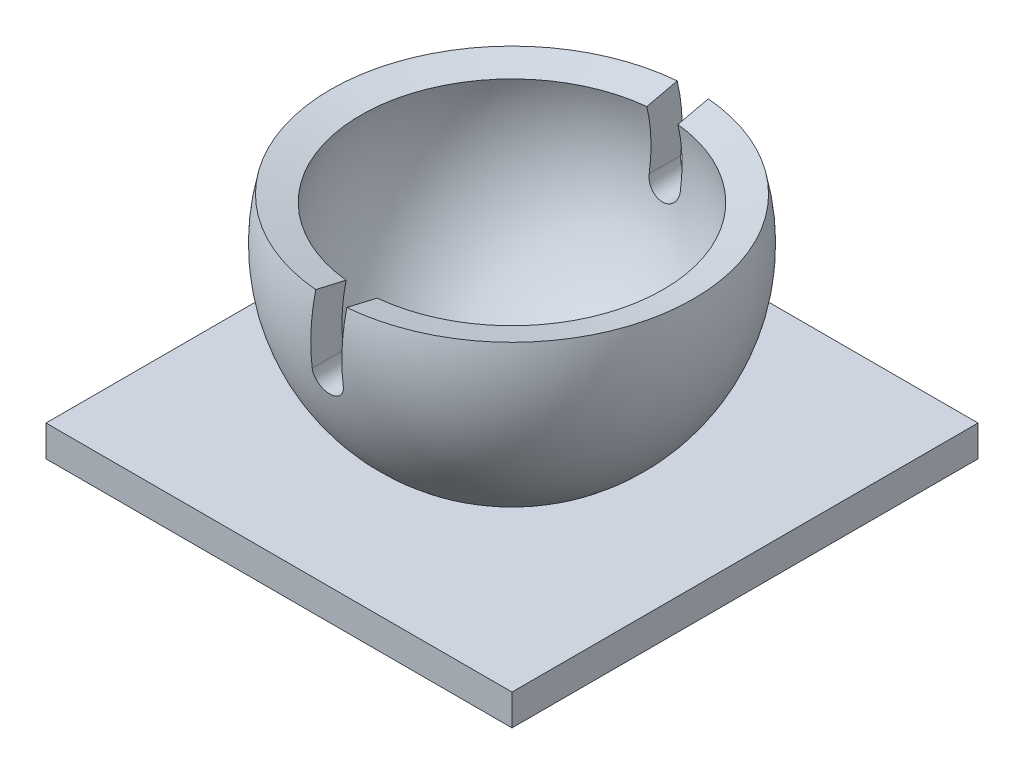
ISO-10303-21;
HEADER;
FILE_DESCRIPTION(('STEP AP214'),'2;1');
FILE_NAME('part.step','',(''),(''),'','','');
FILE_SCHEMA(('AUTOMOTIVE_DESIGN { 1 0 10303 214 1 1 1 1 }'));
ENDSEC;
DATA;
#1=APPLICATION_CONTEXT('core data for automotive mechanical design processes');
#2=APPLICATION_PROTOCOL_DEFINITION('international standard','automotive_design',2000,#1);
#3=PRODUCT_CONTEXT('',#1,'mechanical');
#4=PRODUCT('Part','Part','',(#3));
#5=PRODUCT_RELATED_PRODUCT_CATEGORY('part','',(#4));
#6=PRODUCT_DEFINITION_FORMATION('','',#4);
#7=PRODUCT_DEFINITION_CONTEXT('part definition',#1,'design');
#8=PRODUCT_DEFINITION('design','',#6,#7);
#9=PRODUCT_DEFINITION_SHAPE('','',#8);
#10=(LENGTH_UNIT() NAMED_UNIT(*) SI_UNIT(.MILLI.,.METRE.));
#11=(NAMED_UNIT(*) PLANE_ANGLE_UNIT() SI_UNIT($,.RADIAN.));
#12=(NAMED_UNIT(*) SI_UNIT($,.STERADIAN.) SOLID_ANGLE_UNIT());
#13=UNCERTAINTY_MEASURE_WITH_UNIT(LENGTH_MEASURE(1.E-05),#10,'distance_accuracy_value','');
#14=(GEOMETRIC_REPRESENTATION_CONTEXT(3) GLOBAL_UNCERTAINTY_ASSIGNED_CONTEXT((#13)) GLOBAL_UNIT_ASSIGNED_CONTEXT((#10,
#11,#12)) REPRESENTATION_CONTEXT('',''));
#15=CARTESIAN_POINT('',(0.,0.,0.));
#16=DIRECTION('',(0.,0.,1.));
#17=DIRECTION('',(1.,0.,0.));
#18=AXIS2_PLACEMENT_3D('',#15,#16,#17);
#19=CARTESIAN_POINT('',(0.,2.16217489974353,0.));
#20=DIRECTION('',(0.,1.,0.));
#21=DIRECTION('',(-1.,0.,0.));
#22=AXIS2_PLACEMENT_3D('',#19,#20,#21);
#23=CONICAL_SURFACE('',#22,23.3581886187045,1.34218204127667);
#24=CARTESIAN_POINT('',(0.,2.16217489974353,0.));
#25=DIRECTION('',(0.,1.,0.));
#26=DIRECTION('',(-1.,0.,0.));
#27=AXIS2_PLACEMENT_3D('',#24,#25,#26);
#28=CIRCLE('',#27,23.3581886187045);
#29=CARTESIAN_POINT('',(2.,2.16217489974353,23.2724080306911));
#30=VERTEX_POINT('',#29);
#31=CARTESIAN_POINT('',(2.,2.16217489974353,-23.2724080306911));
#32=VERTEX_POINT('',#31);
#33=EDGE_CURVE('E236',#30,#32,#28,.T.);
#34=ORIENTED_EDGE('',*,*,#33,.T.);
#35=CARTESIAN_POINT('',(2.,8.69454104475557,-51.3934916791892));
#36=CARTESIAN_POINT('',(2.,8.44441020781194,-50.3176874556999));
#37=CARTESIAN_POINT('',(2.,8.19429013732023,-49.2418807287818));
#38=CARTESIAN_POINT('',(2.,7.69407505448133,-47.0902504291092));
#39=CARTESIAN_POINT('',(2.,7.44398004240129,-46.0144268562924));
#40=CARTESIAN_POINT('',(2.,6.94321866661159,-43.8601701219227));
#41=CARTESIAN_POINT('',(2.,6.6925523838851,-42.7817369415447));
#42=CARTESIAN_POINT('',(2.,6.19126436017399,-40.6248712911531));
#43=CARTESIAN_POINT('',(2.,5.94064261877963,-39.5464388212347));
#44=CARTESIAN_POINT('',(2.,5.43004718041413,-37.3490849054346));
#45=CARTESIAN_POINT('',(2.,5.17007552951409,-36.2301629841016));
#46=CARTESIAN_POINT('',(2.,4.65020009983294,-33.9922684978802));
#47=CARTESIAN_POINT('',(2.,4.39029632328636,-32.8732959324727));
#48=CARTESIAN_POINT('',(2.,3.87122244819157,-30.6380477327353));
#49=CARTESIAN_POINT('',(2.,3.61205210220396,-29.5217721558681));
#50=CARTESIAN_POINT('',(2.,3.09388052803709,-27.289309718681));
#51=CARTESIAN_POINT('',(2.,2.83487928452789,-26.1731228619196));
#52=CARTESIAN_POINT('',(2.,2.33039867048759,-23.9981171179131));
#53=CARTESIAN_POINT('',(2.,2.08490904261678,-22.9393006098968));
#54=CARTESIAN_POINT('',(2.,1.59410599634934,-20.8211830507793));
#55=CARTESIAN_POINT('',(2.,1.34879268685224,-19.7618819744367));
#56=CARTESIAN_POINT('',(2.,0.856664181966741,-17.6347973194442));
#57=CARTESIAN_POINT('',(2.,0.609852459648279,-16.5670129372667));
#58=CARTESIAN_POINT('',(2.,0.117343228377695,-14.4328450415481));
#59=CARTESIAN_POINT('',(2.,-0.128355386803524,-13.3664617836209));
#60=CARTESIAN_POINT('',(2.,-0.492399487907965,-11.7813281502943));
#61=CARTESIAN_POINT('',(2.,-0.61131905529437,-11.2627096573455));
#62=CARTESIAN_POINT('',(2.,-0.848643448048677,-10.2252500076351));
#63=CARTESIAN_POINT('',(2.,-0.967048170218366,-9.70640882724113));
#64=CARTESIAN_POINT('',(2.,-1.2036892513655,-8.66557452548756));
#65=CARTESIAN_POINT('',(2.,-1.32192079592858,-8.14358030937122));
#66=CARTESIAN_POINT('',(2.,-1.55688593228373,-7.09964499267051));
#67=CARTESIAN_POINT('',(2.,-1.67362053332015,-6.57770412026182));
#68=CARTESIAN_POINT('',(2.,-1.84559396369289,-5.79929507989012));
#69=CARTESIAN_POINT('',(2.,-1.90186271874453,-5.54305472071532));
#70=CARTESIAN_POINT('',(2.,-2.01344383844931,-5.03036039633225));
#71=CARTESIAN_POINT('',(2.,-2.06875618592246,-4.77390642737345));
#72=CARTESIAN_POINT('',(2.,-2.1780975481452,-4.25999316997177));
#73=CARTESIAN_POINT('',(2.,-2.23212265011098,-4.002533047598));
#74=CARTESIAN_POINT('',(2.,-2.33791234494727,-3.48715937532827));
#75=CARTESIAN_POINT('',(2.,-2.3896770732201,-3.22924585355757));
#76=CARTESIAN_POINT('',(2.,-2.46412408433893,-2.84350097700784));
#77=CARTESIAN_POINT('',(2.,-2.48825650411705,-2.71595030275213));
#78=CARTESIAN_POINT('',(2.,-2.53527009134437,-2.460619288343));
#79=CARTESIAN_POINT('',(2.,-2.55815127741826,-2.33283895163739));
#80=CARTESIAN_POINT('',(2.,-2.60225571235431,-2.07693043619601));
#81=CARTESIAN_POINT('',(2.,-2.62347820180937,-1.94880212560327));
#82=CARTESIAN_POINT('',(2.,-2.66367177095657,-1.69218672798008));
#83=CARTESIAN_POINT('',(2.,-2.68264281441033,-1.56369963520888));
#84=CARTESIAN_POINT('',(2.,-2.71745485776008,-1.3070562477473));
#85=CARTESIAN_POINT('',(2.,-2.73331341815711,-1.17890237447306));
#86=CARTESIAN_POINT('',(2.,-2.76109075308505,-0.922161551035726));
#87=CARTESIAN_POINT('',(2.,-2.77300963408229,-0.793574612670724));
#88=CARTESIAN_POINT('',(2.,-2.7918966544362,-0.536180137725813));
#89=CARTESIAN_POINT('',(2.,-2.79887068675255,-0.40737304772608));
#90=CARTESIAN_POINT('',(2.,-2.80713929932209,-0.149578284883391));
#91=CARTESIAN_POINT('',(2.,-2.80843426856049,-0.0205906250138978));
#92=CARTESIAN_POINT('',(2.,-2.80519656917286,0.236744291342711));
#93=CARTESIAN_POINT('',(2.,-2.80068935797277,0.365091881839768));
#94=CARTESIAN_POINT('',(2.,-2.78640712898619,0.621494588177228));
#95=CARTESIAN_POINT('',(2.,-2.77663164075129,0.749549676871993));
#96=CARTESIAN_POINT('',(2.,-2.75271843548304,1.00540392634853));
#97=CARTESIAN_POINT('',(2.,-2.73857521853914,1.13320255882091));
#98=CARTESIAN_POINT('',(2.,-2.70691376566308,1.38837236574765));
#99=CARTESIAN_POINT('',(2.,-2.6893955407824,1.51574354160034));
#100=CARTESIAN_POINT('',(2.,-2.65171376377919,1.77087921878172));
#101=CARTESIAN_POINT('',(2.,-2.63153479811795,1.89864141373638));
#102=CARTESIAN_POINT('',(2.,-2.58926963288461,2.15384584538441));
#103=CARTESIAN_POINT('',(2.,-2.56718344956086,2.28128808479408));
#104=CARTESIAN_POINT('',(2.,-2.49885013836222,2.66309548926931));
#105=CARTESIAN_POINT('',(2.,-2.45050604895816,2.91708331577157));
#106=CARTESIAN_POINT('',(2.,-2.34997166195666,3.42783272971789));
#107=CARTESIAN_POINT('',(2.,-2.29773839085315,3.68458569701823));
#108=CARTESIAN_POINT('',(2.,-2.19126767621757,4.19770376099338));
#109=CARTESIAN_POINT('',(2.,-2.13703001561726,4.45406881251037));
#110=CARTESIAN_POINT('',(2.,-2.02742117230043,4.96583018586036));
#111=CARTESIAN_POINT('',(2.,-1.97205345147424,5.22122725261318));
#112=CARTESIAN_POINT('',(2.,-1.8604530825348,5.73182376738308));
#113=CARTESIAN_POINT('',(2.,-1.80422046129231,5.98702322128192));
#114=CARTESIAN_POINT('',(2.,-1.63245232713266,6.7622394207894));
#115=CARTESIAN_POINT('',(2.,-1.51597525436658,7.28204725850749));
#116=CARTESIAN_POINT('',(2.,-1.2816227161113,8.32173723628004));
#117=CARTESIAN_POINT('',(2.,-1.16374630982008,8.84161916345176));
#118=CARTESIAN_POINT('',(2.,-0.92784532366664,9.87833186653486));
#119=CARTESIAN_POINT('',(2.,-0.809825152345477,10.3951636458648));
#120=CARTESIAN_POINT('',(2.,-0.573298998322862,11.4286110997478));
#121=CARTESIAN_POINT('',(2.,-0.454793113627369,11.9452267967529));
#122=CARTESIAN_POINT('',(2.,-0.214103630790685,12.9928766750854));
#123=CARTESIAN_POINT('',(2.,-0.0919101609219939,13.5239085879583));
#124=CARTESIAN_POINT('',(2.,0.152741897875409,14.5859405061611));
#125=CARTESIAN_POINT('',(2.,0.27520050030819,15.1169405083792));
#126=CARTESIAN_POINT('',(2.,0.643200561734419,16.7113733177108));
#127=CARTESIAN_POINT('',(2.,0.889021779313902,17.7747415476448));
#128=CARTESIAN_POINT('',(2.,1.37919893817848,19.8932060879681));
#129=CARTESIAN_POINT('',(2.,1.62355161836561,20.948303153318));
#130=CARTESIAN_POINT('',(2.,2.11243132626854,23.0580269311111));
#131=CARTESIAN_POINT('',(2.,2.35695825000927,24.1126536676496));
#132=CARTESIAN_POINT('',(2.,2.8593433945831,26.2785640006001));
#133=CARTESIAN_POINT('',(2.,3.11721155256767,27.3898452917712));
#134=CARTESIAN_POINT('',(2.,3.63311358480922,29.6124933600824));
#135=CARTESIAN_POINT('',(2.,3.8911474737169,30.7238601338215));
#136=CARTESIAN_POINT('',(2.,4.40793130524001,32.9492245039805));
#137=CARTESIAN_POINT('',(2.,4.66668148631043,34.0632220450227));
#138=CARTESIAN_POINT('',(2.,5.18424889318249,36.2911677694388));
#139=CARTESIAN_POINT('',(2.,5.44306611684087,37.4051159533106));
#140=CARTESIAN_POINT('',(2.,5.95151177593954,39.5932104510489));
#141=CARTESIAN_POINT('',(2.,6.20113821640629,40.6673572284954));
#142=CARTESIAN_POINT('',(2.,6.70043511786709,42.8156512753266));
#143=CARTESIAN_POINT('',(2.,6.9501055792557,43.8897985446196));
#144=CARTESIAN_POINT('',(2.,7.44888937828235,46.0355454257602));
#145=CARTESIAN_POINT('',(2.,7.69800263730427,47.1071450558826));
#146=CARTESIAN_POINT('',(2.,8.19625405044116,49.2503278453128));
#147=CARTESIAN_POINT('',(2.,8.44539220429837,50.3219110046805));
#148=CARTESIAN_POINT('',(2.,8.69454104475557,51.3934916791892));
#149=B_SPLINE_CURVE_WITH_KNOTS('',3,(#35,#36,#37,#38,#39,#40,#41,#42,#43,#44,#45,#46,#47,#48,
#49,#50,#51,#52,#53,#54,#55,#56,#57,#58,#59,#60,#61,#62,#63,#64,#65,#66,#67,#68,#69,#70,#71,#72,
#73,#74,#75,#76,#77,#78,#79,#80,#81,#82,#83,#84,#85,#86,#87,#88,#89,#90,#91,#92,#93,#94,#95,#96,
#97,#98,#99,#100,#101,#102,#103,#104,#105,#106,#107,#108,#109,#110,#111,#112,#113,#114,#115,
#116,#117,#118,#119,#120,#121,#122,#123,#124,#125,#126,#127,#128,#129,#130,#131,#132,#133,#134,
#135,#136,#137,#138,#139,#140,#141,#142,#143,#144,#145,#146,#147,#148),.UNSPECIFIED.,.F.,.F.,(4,
2,2,2,2,2,2,2,2,2,2,2,2,2,2,2,2,2,2,2,2,2,2,2,2,2,2,2,2,2,2,2,2,2,2,2,2,2,2,2,2,2,2,2,2,2,2,2,2,
2,2,2,2,2,2,2,4),(0.,3.31349988185216,6.62703196582337,9.94857759761049,13.270090903016,
16.7162690346055,20.1625490801313,23.6004501616125,27.0379772654849,30.2986854524587,
33.5606903623537,36.8485034885407,40.1314693532274,41.7277032220403,43.3242435218826,
44.9298922742201,46.5343946174647,47.3214307840259,48.1084810734909,48.8976785446559,
49.6868286757812,50.0762647435,50.4656950128634,50.8553025446078,51.244916346469,
51.6322644384265,52.0196020617895,52.4064773011235,52.7933260411744,53.1784832294001,
53.5636748172246,53.9493534356628,54.3350307912159,54.7230495031414,55.1110649097046,
55.8866647373648,56.6726925968421,57.4588058312319,58.2427932603044,59.0267563814228,
60.6248462394702,62.2240793768293,63.8144859811453,65.4045860912742,67.0393138711699,
68.6741269696807,71.948362657026,75.1974305558531,78.4452419048429,81.8676648444666,
85.2904500113806,88.7214089992471,92.1522692691114,95.4605833302057,98.7689287254693,
102.069451206136,105.36994246977),.UNSPECIFIED.);
#150=CARTESIAN_POINT('',(2.,1.25565710505479,-19.3592037886823));
#151=VERTEX_POINT('',#150);
#152=EDGE_CURVE('E245',#32,#151,#149,.T.);
#153=ORIENTED_EDGE('',*,*,#152,.T.);
#154=CARTESIAN_POINT('',(0.,1.25565710505479,0.));
#155=DIRECTION('',(0.,1.,0.));
#156=DIRECTION('',(-1.,0.,0.));
#157=AXIS2_PLACEMENT_3D('',#154,#155,#156);
#158=CIRCLE('',#157,19.4622396278468);
#159=CARTESIAN_POINT('',(2.,1.25565710505479,19.3592037886823));
#160=VERTEX_POINT('',#159);
#161=EDGE_CURVE('E229',#160,#151,#158,.T.);
#162=ORIENTED_EDGE('',*,*,#161,.F.);
#163=EDGE_CURVE('E244',#160,#30,#149,.T.);
#164=ORIENTED_EDGE('',*,*,#163,.T.);
#165=EDGE_LOOP('',(#34,#153,#162,#164));
#166=FACE_BOUND('',#165,.T.);
#167=ADVANCED_FACE('F35',(#166),#23,.F.);
#168=CARTESIAN_POINT('',(0.,-3.35099337748345,0.));
#169=DIRECTION('',(0.,1.,0.));
#170=DIRECTION('',(1.,0.,0.));
#171=AXIS2_PLACEMENT_3D('',#168,#169,#170);
#172=SPHERICAL_SURFACE('',#171,20.);
#173=CARTESIAN_POINT('',(0.,-23.3509933774835,0.));
#174=VERTEX_POINT('',#173);
#175=VERTEX_LOOP('',#174);
#176=FACE_BOUND('',#175,.T.);
#177=ORIENTED_EDGE('',*,*,#161,.T.);
#178=CARTESIAN_POINT('',(2.,-3.35099337748345,0.));
#179=DIRECTION('',(1.,0.,0.));
#180=DIRECTION('',(0.,0.,-1.));
#181=AXIS2_PLACEMENT_3D('',#178,#179,#180);
#182=CIRCLE('',#181,19.8997487421324);
#183=CARTESIAN_POINT('',(2.,-6.3804306290063,-19.667803892125));
#184=VERTEX_POINT('',#183);
#185=EDGE_CURVE('E241',#151,#184,#182,.F.);
#186=ORIENTED_EDGE('',*,*,#185,.T.);
#187=CARTESIAN_POINT('',(1.99999999,-6.3802306290063,-19.6678346981559));
#188=CARTESIAN_POINT('',(2.00000492924338,-6.43699906380611,-19.6590906866457));
#189=CARTESIAN_POINT('',(1.99759286722976,-6.49373977434951,-19.6503450418694));
#190=CARTESIAN_POINT('',(1.98795687162081,-6.60681734610184,-19.6329044490153));
#191=CARTESIAN_POINT('',(1.98073306294222,-6.66315421775637,-19.6242094996274));
#192=CARTESIAN_POINT('',(1.95190136374699,-6.83089931555426,-19.5983028234515));
#193=CARTESIAN_POINT('',(1.92313308554919,-6.94118743135091,-19.581246870168));
#194=CARTESIAN_POINT('',(1.84724845113372,-7.15542196601706,-19.5480743489547));
#195=CARTESIAN_POINT('',(1.80012163594724,-7.25936473078687,-19.5319583225348));
#196=CARTESIAN_POINT('',(1.68879655848839,-7.4578834619899,-19.501143449193));
#197=CARTESIAN_POINT('',(1.62460317515794,-7.55246209482621,-19.4864441988808));
#198=CARTESIAN_POINT('',(1.48127554317915,-7.72901768013369,-19.458976805754));
#199=CARTESIAN_POINT('',(1.40222058602788,-7.81105750210565,-19.446199034234));
#200=CARTESIAN_POINT('',(1.23113885814396,-7.96068702122408,-19.4228749457925));
#201=CARTESIAN_POINT('',(1.13911072052416,-8.02827519381715,-19.4123288643007));
#202=CARTESIAN_POINT('',(0.945821163044194,-8.1462440266236,-19.3939101879149));
#203=CARTESIAN_POINT('',(0.844676359441907,-8.19681123429498,-19.3860086154301));
#204=CARTESIAN_POINT('',(0.635171138290144,-8.28023777249555,-19.3729672403095));
#205=CARTESIAN_POINT('',(0.526811662409921,-8.31309940891011,-19.3678270780416));
#206=CARTESIAN_POINT('',(0.307193282780582,-8.35985044503843,-19.3605130885571));
#207=CARTESIAN_POINT('',(0.195977769331188,-8.37393894650324,-19.358308131762));
#208=CARTESIAN_POINT('',(-0.0272648929103377,-8.38336272334667,-19.3568333241558));
#209=CARTESIAN_POINT('',(-0.139292027767614,-8.37869831993876,-19.3575634230709));
#210=CARTESIAN_POINT('',(-0.360363740478058,-8.35083329975726,-19.3619237691294));
#211=CARTESIAN_POINT('',(-0.469420780931434,-8.32772901875647,-19.3655389437133));
#212=CARTESIAN_POINT('',(-0.682076243823327,-8.26380510469144,-19.3755362538956));
#213=CARTESIAN_POINT('',(-0.785674659853323,-8.22298545082957,-19.3819183927423));
#214=CARTESIAN_POINT('',(-0.98479703457854,-8.12471704582601,-19.3972718760161));
#215=CARTESIAN_POINT('',(-1.08029838833382,-8.06722360120224,-19.4062501791733));
#216=CARTESIAN_POINT('',(-1.26028788570385,-7.93734786177252,-19.4265139984326));
#217=CARTESIAN_POINT('',(-1.34477611903518,-7.86496568826753,-19.4377994957376));
#218=CARTESIAN_POINT('',(-1.50118670375667,-7.70667778143506,-19.462453542137));
#219=CARTESIAN_POINT('',(-1.57298761753907,-7.62065489840019,-19.4758401246463));
#220=CARTESIAN_POINT('',(-1.7011777718909,-7.43799682070185,-19.5042316002799));
#221=CARTESIAN_POINT('',(-1.75756121602902,-7.34135765377381,-19.5192370991117));
#222=CARTESIAN_POINT('',(-1.85399847519852,-7.13899151176761,-19.5506197845537));
#223=CARTESIAN_POINT('',(-1.89384403811638,-7.03316780665335,-19.5670115085768));
#224=CARTESIAN_POINT('',(-1.95511140413653,-6.81651946530383,-19.6005250434442));
#225=CARTESIAN_POINT('',(-1.97655986344338,-6.70570231031422,-19.6176457601145));
#226=CARTESIAN_POINT('',(-1.99237963654691,-6.55849845315122,-19.6403576805384));
#227=CARTESIAN_POINT('',(-1.99524198243743,-6.52287229452151,-19.6458520853537));
#228=CARTESIAN_POINT('',(-1.99905135390723,-6.4515791303373,-19.6568425771864));
#229=CARTESIAN_POINT('',(-2.00000157653015,-6.41591229289562,-19.6623386460034));
#230=CARTESIAN_POINT('',(-1.99999999000007,-6.3802306290063,-19.6678346981559));
#231=B_SPLINE_CURVE_WITH_KNOTS('',3,(#187,#188,#189,#190,#191,#192,#193,#194,#195,#196,#197,
#198,#199,#200,#201,#202,#203,#204,#205,#206,#207,#208,#209,#210,#211,#212,#213,#214,#215,#216,
#217,#218,#219,#220,#221,#222,#223,#224,#225,#226,#227,#228,#229,#230),.UNSPECIFIED.,.F.,.F.,(4,
2,2,2,2,2,2,2,2,2,2,2,2,2,2,2,2,2,2,2,2,4),(0.,0.172208360211171,0.344412249931739,
0.688384253239082,1.03255250672587,1.37662247597216,1.71890629689398,2.06122620869854,
2.39966190185471,2.73805350817218,3.07282689620081,3.40759455001012,3.74062463027895,
4.07365510152223,4.40758663233695,4.7415154426636,5.07848517415655,5.41558142087747,
5.75680239744352,6.09752812780951,6.20597489977021,6.31424019906812),.UNSPECIFIED.);
#232=CARTESIAN_POINT('',(-2.,-6.3804306290063,-19.667803892125));
#233=VERTEX_POINT('',#232);
#234=EDGE_CURVE('E302',#184,#233,#231,.T.);
#235=ORIENTED_EDGE('',*,*,#234,.T.);
#236=CARTESIAN_POINT('',(-2.,-3.35099337748345,0.));
#237=DIRECTION('',(-1.,0.,0.));
#238=DIRECTION('',(0.,-1.,0.));
#239=AXIS2_PLACEMENT_3D('',#236,#237,#238);
#240=CIRCLE('',#239,19.8997487421324);
#241=CARTESIAN_POINT('',(-2.,1.25565710505479,-19.3592037886823));
#242=VERTEX_POINT('',#241);
#243=EDGE_CURVE('E188',#233,#242,#240,.F.);
#244=ORIENTED_EDGE('',*,*,#243,.T.);
#245=CARTESIAN_POINT('',(-2.,1.25565710505479,19.3592037886823));
#246=VERTEX_POINT('',#245);
#247=EDGE_CURVE('E232',#242,#246,#158,.T.);
#248=ORIENTED_EDGE('',*,*,#247,.T.);
#249=CARTESIAN_POINT('',(-2.,-6.3804306290063,19.667803892125));
#250=VERTEX_POINT('',#249);
#251=EDGE_CURVE('E304',#246,#250,#240,.F.);
#252=ORIENTED_EDGE('',*,*,#251,.T.);
#253=CARTESIAN_POINT('',(-1.99999999,-6.3802306290063,19.6678346981559));
#254=CARTESIAN_POINT('',(-2.00000492924337,-6.43699906380611,19.6590906866457));
#255=CARTESIAN_POINT('',(-1.99759286722975,-6.49373977434951,19.6503450418694));
#256=CARTESIAN_POINT('',(-1.9879568716208,-6.60681734610184,19.6329044490153));
#257=CARTESIAN_POINT('',(-1.98073306294221,-6.66315421775637,19.6242094996274));
#258=CARTESIAN_POINT('',(-1.95190136374698,-6.83089931555426,19.5983028234515));
#259=CARTESIAN_POINT('',(-1.92313308554918,-6.94118743135091,19.581246870168));
#260=CARTESIAN_POINT('',(-1.84724845113371,-7.15542196601706,19.5480743489547));
#261=CARTESIAN_POINT('',(-1.80012163594724,-7.25936473078687,19.5319583225348));
#262=CARTESIAN_POINT('',(-1.68879655848838,-7.4578834619899,19.501143449193));
#263=CARTESIAN_POINT('',(-1.62460317515793,-7.55246209482621,19.4864441988808));
#264=CARTESIAN_POINT('',(-1.48127554317914,-7.72901768013369,19.458976805754));
#265=CARTESIAN_POINT('',(-1.40222058602787,-7.81105750210565,19.446199034234));
#266=CARTESIAN_POINT('',(-1.23113885814396,-7.96068702122408,19.4228749457925));
#267=CARTESIAN_POINT('',(-1.13911072052415,-8.02827519381715,19.4123288643007));
#268=CARTESIAN_POINT('',(-0.945821163044188,-8.1462440266236,19.3939101879149));
#269=CARTESIAN_POINT('',(-0.844676359441902,-8.19681123429498,19.3860086154301));
#270=CARTESIAN_POINT('',(-0.635171138290139,-8.28023777249555,19.3729672403095));
#271=CARTESIAN_POINT('',(-0.526811662409916,-8.31309940891011,19.3678270780416));
#272=CARTESIAN_POINT('',(-0.307193282780576,-8.35985044503843,19.3605130885571));
#273=CARTESIAN_POINT('',(-0.195977769331182,-8.37393894650324,19.358308131762));
#274=CARTESIAN_POINT('',(0.0272648929103429,-8.38336272334667,19.3568333241558));
#275=CARTESIAN_POINT('',(0.13929202776762,-8.37869831993876,19.3575634230709));
#276=CARTESIAN_POINT('',(0.360363740478064,-8.35083329975726,19.3619237691294));
#277=CARTESIAN_POINT('',(0.469420780931439,-8.32772901875647,19.3655389437133));
#278=CARTESIAN_POINT('',(0.682076243823332,-8.26380510469144,19.3755362538956));
#279=CARTESIAN_POINT('',(0.785674659853329,-8.22298545082957,19.3819183927423));
#280=CARTESIAN_POINT('',(0.984797034578545,-8.12471704582601,19.3972718760161));
#281=CARTESIAN_POINT('',(1.08029838833382,-8.06722360120224,19.4062501791733));
#282=CARTESIAN_POINT('',(1.26028788570386,-7.93734786177252,19.4265139984326));
#283=CARTESIAN_POINT('',(1.34477611903519,-7.86496568826753,19.4377994957376));
#284=CARTESIAN_POINT('',(1.50118670375668,-7.70667778143506,19.462453542137));
#285=CARTESIAN_POINT('',(1.57298761753907,-7.62065489840019,19.4758401246463));
#286=CARTESIAN_POINT('',(1.7011777718909,-7.43799682070185,19.5042316002799));
#287=CARTESIAN_POINT('',(1.75756121602903,-7.34135765377381,19.5192370991117));
#288=CARTESIAN_POINT('',(1.85399847519853,-7.13899151176761,19.5506197845537));
#289=CARTESIAN_POINT('',(1.89384403811638,-7.03316780665335,19.5670115085768));
#290=CARTESIAN_POINT('',(1.95511140413654,-6.81651946530383,19.6005250434442));
#291=CARTESIAN_POINT('',(1.97655986344338,-6.70570231031422,19.6176457601145));
#292=CARTESIAN_POINT('',(1.99237963654692,-6.55849845315122,19.6403576805384));
#293=CARTESIAN_POINT('',(1.99524198243744,-6.52287229452151,19.6458520853537));
#294=CARTESIAN_POINT('',(1.99905135390724,-6.4515791303373,19.6568425771864));
#295=CARTESIAN_POINT('',(2.00000157653015,-6.41591229289562,19.6623386460034));
#296=CARTESIAN_POINT('',(1.99999999000007,-6.3802306290063,19.6678346981559));
#297=B_SPLINE_CURVE_WITH_KNOTS('',3,(#253,#254,#255,#256,#257,#258,#259,#260,#261,#262,#263,
#264,#265,#266,#267,#268,#269,#270,#271,#272,#273,#274,#275,#276,#277,#278,#279,#280,#281,#282,
#283,#284,#285,#286,#287,#288,#289,#290,#291,#292,#293,#294,#295,#296),.UNSPECIFIED.,.F.,.F.,(4,
2,2,2,2,2,2,2,2,2,2,2,2,2,2,2,2,2,2,2,2,4),(0.,0.172208360211171,0.344412249931739,
0.688384253239082,1.03255250672587,1.37662247597216,1.71890629689398,2.06122620869854,
2.39966190185471,2.73805350817218,3.07282689620081,3.40759455001012,3.74062463027895,
4.07365510152223,4.40758663233695,4.7415154426636,5.07848517415655,5.41558142087747,
5.75680239744352,6.09752812780951,6.20597489977021,6.31424019906812),.UNSPECIFIED.);
#298=CARTESIAN_POINT('',(2.,-6.3804306290063,19.667803892125));
#299=VERTEX_POINT('',#298);
#300=EDGE_CURVE('E252',#250,#299,#297,.T.);
#301=ORIENTED_EDGE('',*,*,#300,.T.);
#302=EDGE_CURVE('E240',#299,#160,#182,.F.);
#303=ORIENTED_EDGE('',*,*,#302,.T.);
#304=EDGE_LOOP('',(#177,#186,#235,#244,#248,#252,#301,#303));
#305=FACE_BOUND('',#304,.T.);
#306=ADVANCED_FACE('F37',(#176,#305),#172,.F.);
#307=CARTESIAN_POINT('',(-2.,2.16217489974353,-23.2724080306911));
#308=VERTEX_POINT('',#307);
#309=CARTESIAN_POINT('',(-2.,2.16217489974353,23.2724080306911));
#310=VERTEX_POINT('',#309);
#311=EDGE_CURVE('E237',#308,#310,#28,.T.);
#312=ORIENTED_EDGE('',*,*,#311,.T.);
#313=CARTESIAN_POINT('',(-2.,8.69454104475557,51.3934916791892));
#314=CARTESIAN_POINT('',(-2.,8.44441020781194,50.3176874556999));
#315=CARTESIAN_POINT('',(-2.,8.19429013732023,49.2418807287818));
#316=CARTESIAN_POINT('',(-2.,7.69407505448133,47.0902504291092));
#317=CARTESIAN_POINT('',(-2.,7.44398004240129,46.0144268562924));
#318=CARTESIAN_POINT('',(-2.,6.94321866661159,43.8601701219227));
#319=CARTESIAN_POINT('',(-2.,6.6925523838851,42.7817369415447));
#320=CARTESIAN_POINT('',(-2.,6.19126436017399,40.6248712911531));
#321=CARTESIAN_POINT('',(-2.,5.94064261877963,39.5464388212346));
#322=CARTESIAN_POINT('',(-2.,5.43004718041413,37.3490849054346));
#323=CARTESIAN_POINT('',(-2.,5.17007552951409,36.2301629841016));
#324=CARTESIAN_POINT('',(-2.,4.65020009983293,33.9922684978802));
#325=CARTESIAN_POINT('',(-2.,4.39029632328636,32.8732959324727));
#326=CARTESIAN_POINT('',(-2.,3.87122244819157,30.6380477327352));
#327=CARTESIAN_POINT('',(-2.,3.61205210220396,29.5217721558681));
#328=CARTESIAN_POINT('',(-2.,3.09388052803708,27.289309718681));
#329=CARTESIAN_POINT('',(-2.,2.83487928452788,26.1731228619196));
#330=CARTESIAN_POINT('',(-2.,2.33039867048759,23.9981171179131));
#331=CARTESIAN_POINT('',(-2.,2.08490904261678,22.9393006098968));
#332=CARTESIAN_POINT('',(-2.,1.59410599634934,20.8211830507793));
#333=CARTESIAN_POINT('',(-2.,1.34879268685224,19.7618819744367));
#334=CARTESIAN_POINT('',(-2.,0.85666418196674,17.6347973194442));
#335=CARTESIAN_POINT('',(-2.,0.609852459648279,16.5670129372667));
#336=CARTESIAN_POINT('',(-2.,0.117343228377694,14.4328450415481));
#337=CARTESIAN_POINT('',(-2.,-0.128355386803525,13.3664617836209));
#338=CARTESIAN_POINT('',(-2.,-0.492399487907966,11.7813281502943));
#339=CARTESIAN_POINT('',(-2.,-0.611319055294371,11.2627096573455));
#340=CARTESIAN_POINT('',(-2.,-0.848643448048678,10.2252500076351));
#341=CARTESIAN_POINT('',(-2.,-0.967048170218367,9.70640882724113));
#342=CARTESIAN_POINT('',(-2.,-1.2036892513655,8.66557452548756));
#343=CARTESIAN_POINT('',(-2.,-1.32192079592859,8.14358030937122));
#344=CARTESIAN_POINT('',(-2.,-1.55688593228374,7.09964499267051));
#345=CARTESIAN_POINT('',(-2.,-1.67362053332015,6.57770412026181));
#346=CARTESIAN_POINT('',(-2.,-1.84559396369289,5.79929507989012));
#347=CARTESIAN_POINT('',(-2.,-1.90186271874453,5.54305472071532));
#348=CARTESIAN_POINT('',(-2.,-2.01344383844931,5.03036039633224));
#349=CARTESIAN_POINT('',(-2.,-2.06875618592246,4.77390642737344));
#350=CARTESIAN_POINT('',(-2.,-2.1780975481452,4.25999316997177));
#351=CARTESIAN_POINT('',(-2.,-2.23212265011098,4.00253304759799));
#352=CARTESIAN_POINT('',(-2.,-2.33791234494727,3.48715937532826));
#353=CARTESIAN_POINT('',(-2.,-2.3896770732201,3.22924585355757));
#354=CARTESIAN_POINT('',(-2.,-2.46412408433893,2.84350097700785));
#355=CARTESIAN_POINT('',(-2.,-2.48825650411705,2.71595030275213));
#356=CARTESIAN_POINT('',(-2.,-2.53527009134437,2.46061928834301));
#357=CARTESIAN_POINT('',(-2.,-2.55815127741825,2.33283895163739));
#358=CARTESIAN_POINT('',(-2.,-2.6022557123543,2.07693043619601));
#359=CARTESIAN_POINT('',(-2.,-2.62347820180937,1.94880212560327));
#360=CARTESIAN_POINT('',(-2.,-2.66367177095657,1.69218672798008));
#361=CARTESIAN_POINT('',(-2.,-2.68264281441033,1.56369963520887));
#362=CARTESIAN_POINT('',(-2.,-2.71745485776008,1.30705624774729));
#363=CARTESIAN_POINT('',(-2.,-2.73331341815712,1.17890237447305));
#364=CARTESIAN_POINT('',(-2.,-2.76109075308505,0.922161551035717));
#365=CARTESIAN_POINT('',(-2.,-2.77300963408229,0.793574612670717));
#366=CARTESIAN_POINT('',(-2.,-2.7918966544362,0.536180137725807));
#367=CARTESIAN_POINT('',(-2.,-2.79887068675255,0.407373047726074));
#368=CARTESIAN_POINT('',(-2.,-2.80713929932209,0.149578284883386));
#369=CARTESIAN_POINT('',(-2.,-2.80843426856049,0.0205906250138957));
#370=CARTESIAN_POINT('',(-2.,-2.80519656917286,-0.236744291342711));
#371=CARTESIAN_POINT('',(-2.,-2.80068935797277,-0.365091881839768));
#372=CARTESIAN_POINT('',(-2.,-2.78640712898619,-0.621494588177228));
#373=CARTESIAN_POINT('',(-2.,-2.77663164075129,-0.749549676871993));
#374=CARTESIAN_POINT('',(-2.,-2.75271843548304,-1.00540392634853));
#375=CARTESIAN_POINT('',(-2.,-2.73857521853914,-1.13320255882091));
#376=CARTESIAN_POINT('',(-2.,-2.70691376566308,-1.38837236574765));
#377=CARTESIAN_POINT('',(-2.,-2.6893955407824,-1.51574354160034));
#378=CARTESIAN_POINT('',(-2.,-2.65171376377919,-1.77087921878172));
#379=CARTESIAN_POINT('',(-2.,-2.63153479811795,-1.89864141373638));
#380=CARTESIAN_POINT('',(-2.,-2.58926963288461,-2.15384584538441));
#381=CARTESIAN_POINT('',(-2.,-2.56718344956086,-2.28128808479408));
#382=CARTESIAN_POINT('',(-2.,-2.49885013836222,-2.66309548926931));
#383=CARTESIAN_POINT('',(-2.,-2.45050604895816,-2.91708331577158));
#384=CARTESIAN_POINT('',(-2.,-2.34997166195666,-3.4278327297179));
#385=CARTESIAN_POINT('',(-2.,-2.29773839085315,-3.68458569701824));
#386=CARTESIAN_POINT('',(-2.,-2.19126767621757,-4.19770376099339));
#387=CARTESIAN_POINT('',(-2.,-2.13703001561726,-4.45406881251037));
#388=CARTESIAN_POINT('',(-2.,-2.02742117230043,-4.96583018586037));
#389=CARTESIAN_POINT('',(-2.,-1.97205345147424,-5.22122725261319));
#390=CARTESIAN_POINT('',(-2.,-1.8604530825348,-5.73182376738309));
#391=CARTESIAN_POINT('',(-2.,-1.80422046129231,-5.98702322128192));
#392=CARTESIAN_POINT('',(-2.,-1.63245232713266,-6.76223942078941));
#393=CARTESIAN_POINT('',(-2.,-1.51597525436658,-7.2820472585075));
#394=CARTESIAN_POINT('',(-2.,-1.2816227161113,-8.32173723628004));
#395=CARTESIAN_POINT('',(-2.,-1.16374630982008,-8.84161916345176));
#396=CARTESIAN_POINT('',(-2.,-0.927845323666641,-9.87833186653486));
#397=CARTESIAN_POINT('',(-2.,-0.809825152345476,-10.3951636458648));
#398=CARTESIAN_POINT('',(-2.,-0.57329899832286,-11.4286110997478));
#399=CARTESIAN_POINT('',(-2.,-0.454793113627368,-11.9452267967529));
#400=CARTESIAN_POINT('',(-2.,-0.214103630790685,-12.9928766750854));
#401=CARTESIAN_POINT('',(-2.,-0.0919101609219945,-13.5239085879583));
#402=CARTESIAN_POINT('',(-2.,0.152741897875408,-14.5859405061611));
#403=CARTESIAN_POINT('',(-2.,0.275200500308189,-15.1169405083792));
#404=CARTESIAN_POINT('',(-2.,0.643200561734419,-16.7113733177108));
#405=CARTESIAN_POINT('',(-2.,0.889021779313903,-17.7747415476448));
#406=CARTESIAN_POINT('',(-2.,1.37919893817848,-19.8932060879681));
#407=CARTESIAN_POINT('',(-2.,1.62355161836561,-20.948303153318));
#408=CARTESIAN_POINT('',(-2.,2.11243132626854,-23.0580269311111));
#409=CARTESIAN_POINT('',(-2.,2.35695825000927,-24.1126536676496));
#410=CARTESIAN_POINT('',(-2.,2.8593433945831,-26.2785640006001));
#411=CARTESIAN_POINT('',(-2.,3.11721155256767,-27.3898452917713));
#412=CARTESIAN_POINT('',(-2.,3.63311358480922,-29.6124933600824));
#413=CARTESIAN_POINT('',(-2.,3.89114747371689,-30.7238601338215));
#414=CARTESIAN_POINT('',(-2.,4.40793130524001,-32.9492245039805));
#415=CARTESIAN_POINT('',(-2.,4.66668148631043,-34.0632220450227));
#416=CARTESIAN_POINT('',(-2.,5.18424889318249,-36.2911677694388));
#417=CARTESIAN_POINT('',(-2.,5.44306611684086,-37.4051159533106));
#418=CARTESIAN_POINT('',(-2.,5.95151177593954,-39.5932104510488));
#419=CARTESIAN_POINT('',(-2.,6.20113821640628,-40.6673572284953));
#420=CARTESIAN_POINT('',(-2.,6.70043511786709,-42.8156512753266));
#421=CARTESIAN_POINT('',(-2.,6.9501055792557,-43.8897985446196));
#422=CARTESIAN_POINT('',(-2.,7.44888937828234,-46.0355454257602));
#423=CARTESIAN_POINT('',(-2.,7.69800263730426,-47.1071450558826));
#424=CARTESIAN_POINT('',(-2.,8.19625405044115,-49.2503278453127));
#425=CARTESIAN_POINT('',(-2.,8.44539220429837,-50.3219110046805));
#426=CARTESIAN_POINT('',(-2.,8.69454104475557,-51.3934916791892));
#427=B_SPLINE_CURVE_WITH_KNOTS('',3,(#313,#314,#315,#316,#317,#318,#319,#320,#321,#322,#323,
#324,#325,#326,#327,#328,#329,#330,#331,#332,#333,#334,#335,#336,#337,#338,#339,#340,#341,#342,
#343,#344,#345,#346,#347,#348,#349,#350,#351,#352,#353,#354,#355,#356,#357,#358,#359,#360,#361,
#362,#363,#364,#365,#366,#367,#368,#369,#370,#371,#372,#373,#374,#375,#376,#377,#378,#379,#380,
#381,#382,#383,#384,#385,#386,#387,#388,#389,#390,#391,#392,#393,#394,#395,#396,#397,#398,#399,
#400,#401,#402,#403,#404,#405,#406,#407,#408,#409,#410,#411,#412,#413,#414,#415,#416,#417,#418,
#419,#420,#421,#422,#423,#424,#425,#426),.UNSPECIFIED.,.F.,.F.,(4,2,2,2,2,2,2,2,2,2,2,2,2,2,2,2,
2,2,2,2,2,2,2,2,2,2,2,2,2,2,2,2,2,2,2,2,2,2,2,2,2,2,2,2,2,2,2,2,2,2,2,2,2,2,2,2,4),(0.,
3.31349988185216,6.62703196582337,9.9485775976105,13.2700909030161,16.7162690346055,
20.1625490801313,23.6004501616125,27.0379772654849,30.2986854524587,33.5606903623537,
36.8485034885407,40.1314693532274,41.7277032220403,43.3242435218826,44.9298922742201,
46.5343946174647,47.3214307840259,48.1084810734909,48.8976785446559,49.6868286757812,
50.0762647435,50.4656950128634,50.8553025446078,51.244916346469,51.6322644384265,
52.0196020617895,52.4064773011235,52.7933260411744,53.1784832294001,53.5636748172246,
53.9493534356628,54.3350307912159,54.7230495031414,55.1110649097046,55.8866647373648,
56.6726925968421,57.4588058312319,58.2427932603044,59.0267563814228,60.6248462394702,
62.2240793768293,63.8144859811454,65.4045860912742,67.0393138711699,68.6741269696808,
71.948362657026,75.1974305558532,78.445241904843,81.8676648444666,85.2904500113806,
88.7214089992471,92.1522692691114,95.4605833302057,98.7689287254692,102.069451206136,
105.36994246977),.UNSPECIFIED.);
#428=EDGE_CURVE('E189',#310,#246,#427,.T.);
#429=ORIENTED_EDGE('',*,*,#428,.T.);
#430=ORIENTED_EDGE('',*,*,#247,.F.);
#431=EDGE_CURVE('E180',#242,#308,#427,.T.);
#432=ORIENTED_EDGE('',*,*,#431,.T.);
#433=EDGE_LOOP('',(#312,#429,#430,#432));
#434=FACE_BOUND('',#433,.T.);
#435=ADVANCED_FACE('F191',(#434),#23,.F.);
#436=CARTESIAN_POINT('',(0.,-3.35099337748345,0.));
#437=DIRECTION('',(0.,1.,0.));
#438=DIRECTION('',(-1.,0.,0.));
#439=AXIS2_PLACEMENT_3D('',#436,#437,#438);
#440=SPHERICAL_SURFACE('',#439,24.);
#441=CARTESIAN_POINT('',(0.,-23.3509933774834,0.));
#442=DIRECTION('',(0.,1.,0.));
#443=DIRECTION('',(0.,0.,1.));
#444=AXIS2_PLACEMENT_3D('',#441,#442,#443);
#445=CIRCLE('',#444,13.2664991614216);
#446=CARTESIAN_POINT('',(0.,-23.3509933774834,13.2664991614216));
#447=VERTEX_POINT('',#446);
#448=EDGE_CURVE('E40',#447,#447,#445,.T.);
#449=ORIENTED_EDGE('',*,*,#448,.T.);
#450=EDGE_LOOP('',(#449));
#451=FACE_BOUND('',#450,.T.);
#452=ORIENTED_EDGE('',*,*,#33,.F.);
#453=CARTESIAN_POINT('',(2.,-3.35099337748345,0.));
#454=DIRECTION('',(1.,0.,0.));
#455=DIRECTION('',(0.,0.,-1.));
#456=AXIS2_PLACEMENT_3D('',#453,#454,#455);
#457=CIRCLE('',#456,23.9165214862028);
#458=CARTESIAN_POINT('',(2.,-6.3804306290063,23.7238805834772));
#459=VERTEX_POINT('',#458);
#460=EDGE_CURVE('E11',#30,#459,#457,.T.);
#461=ORIENTED_EDGE('',*,*,#460,.T.);
#462=CARTESIAN_POINT('',(1.99999999,-6.3802306290063,23.723906122601));
#463=CARTESIAN_POINT('',(2.00000502784825,-6.4368393749375,23.7166774560729));
#464=CARTESIAN_POINT('',(1.99760641148623,-6.49342091108162,23.7094489191219));
#465=CARTESIAN_POINT('',(1.98802461049504,-6.60618118649796,23.695036768319));
#466=CARTESIAN_POINT('',(1.98084158110211,-6.66235993877923,23.6878531530171));
#467=CARTESIAN_POINT('',(1.95217591464397,-6.82962232426538,23.6664555085349));
#468=CARTESIAN_POINT('',(1.92357657125672,-6.93958886104452,23.652374660372));
#469=CARTESIAN_POINT('',(1.84815759854771,-7.15319633428077,23.6249996299736));
#470=CARTESIAN_POINT('',(1.80132815746581,-7.2568338295274,23.6117058758125));
#471=CARTESIAN_POINT('',(1.69073841324038,-7.45478909278349,23.5862940769149));
#472=CARTESIAN_POINT('',(1.62698248793029,-7.54910926196585,23.5741757292784));
#473=CARTESIAN_POINT('',(1.484559400783,-7.72537631543756,23.5515133495859));
#474=CARTESIAN_POINT('',(1.40594627831329,-7.80736616544861,23.5409638522813));
#475=CARTESIAN_POINT('',(1.23584830460747,-7.95697996539543,23.5217024972495));
#476=CARTESIAN_POINT('',(1.14436189657171,-8.02460217532919,23.5129908620987));
#477=CARTESIAN_POINT('',(0.951886511197478,-8.1429794089482,23.4977340622039));
#478=CARTESIAN_POINT('',(0.850977177383024,-8.19386182099061,23.4911725369121));
#479=CARTESIAN_POINT('',(0.641939438141663,-8.2779561842134,23.4803251755169));
#480=CARTESIAN_POINT('',(0.533811820122173,-8.31117005923478,23.476039091652));
#481=CARTESIAN_POINT('',(0.314249853835363,-8.35875656826321,23.4698975457139));
#482=CARTESIAN_POINT('',(0.202845413161254,-8.3732649971895,23.4680245654333));
#483=CARTESIAN_POINT('',(-0.0208366146666268,-8.38345321487898,23.4667093546089));
#484=CARTESIAN_POINT('',(-0.133114197843463,-8.37913308935121,23.4672671130001));
#485=CARTESIAN_POINT('',(-0.354929951738381,-8.3518431624636,23.470789757057));
#486=CARTESIAN_POINT('',(-0.464476488275831,-8.32894016028048,23.473746020902));
#487=CARTESIAN_POINT('',(-0.678147614807469,-8.26524995905529,23.4819642045293));
#488=CARTESIAN_POINT('',(-0.782272208403097,-8.22446277189268,23.48722612278));
#489=CARTESIAN_POINT('',(-0.982361699374943,-8.12611535696684,23.4999077727012));
#490=CARTESIAN_POINT('',(-1.07831155683751,-8.06852504047166,23.5073313751707));
#491=CARTESIAN_POINT('',(-1.25917531876573,-7.93828062654849,23.5241102373333));
#492=CARTESIAN_POINT('',(-1.3440894558587,-7.8656268467344,23.5334654562983));
#493=CARTESIAN_POINT('',(-1.50104846090441,-7.70685151071276,23.5538955808764));
#494=CARTESIAN_POINT('',(-1.57301096415337,-7.6206498692716,23.5649807095358));
#495=CARTESIAN_POINT('',(-1.70148413557692,-7.43753196753762,23.588509994719));
#496=CARTESIAN_POINT('',(-1.75798927246579,-7.3406118891205,23.6009546355093));
#497=CARTESIAN_POINT('',(-1.85441291892708,-7.1379663075746,23.626952125666));
#498=CARTESIAN_POINT('',(-1.89418484468178,-7.03217234371734,23.6405135729808));
#499=CARTESIAN_POINT('',(-1.95532181875639,-6.81556449896162,23.668254688006));
#500=CARTESIAN_POINT('',(-1.97671392439432,-6.7047582507729,23.6824334145635));
#501=CARTESIAN_POINT('',(-1.99244624525775,-6.55772024067597,23.7012310899217));
#502=CARTESIAN_POINT('',(-1.99528356750704,-6.52224938236972,23.7057644595106));
#503=CARTESIAN_POINT('',(-1.99905964189372,-6.45126732858746,23.7148337480767));
#504=CARTESIAN_POINT('',(-2.00000155337758,-6.41575629911747,23.7193696501847));
#505=CARTESIAN_POINT('',(-1.99999999000003,-6.3802306290063,23.723906122601));
#506=B_SPLINE_CURVE_WITH_KNOTS('',3,(#462,#463,#464,#465,#466,#467,#468,#469,#470,#471,#472,
#473,#474,#475,#476,#477,#478,#479,#480,#481,#482,#483,#484,#485,#486,#487,#488,#489,#490,#491,
#492,#493,#494,#495,#496,#497,#498,#499,#500,#501,#502,#503,#504,#505),.UNSPECIFIED.,.F.,.F.,(4,
2,2,2,2,2,2,2,2,2,2,2,2,2,2,2,2,2,2,2,2,4),(0.,0.171100432576022,0.342195313856143,
0.683916945579341,1.02582275276373,1.36764021608818,1.70823753142665,2.04887607153369,
2.38685895717862,2.72480503397544,3.06028366574287,3.39576077038711,3.73003726264599,
4.06431353286422,4.39919209165783,4.73406359023775,5.07099471781656,5.40804625605585,
5.74799182460097,6.08743609048153,6.19501613427425,6.30241671031764),.UNSPECIFIED.);
#507=CARTESIAN_POINT('',(-2.,-6.3804306290063,23.7238805834772));
#508=VERTEX_POINT('',#507);
#509=EDGE_CURVE('E45',#459,#508,#506,.T.);
#510=ORIENTED_EDGE('',*,*,#509,.T.);
#511=CARTESIAN_POINT('',(-2.,-3.35099337748345,0.));
#512=DIRECTION('',(-1.,0.,0.));
#513=DIRECTION('',(0.,-1.,0.));
#514=AXIS2_PLACEMENT_3D('',#511,#512,#513);
#515=CIRCLE('',#514,23.9165214862028);
#516=EDGE_CURVE('E220',#508,#310,#515,.T.);
#517=ORIENTED_EDGE('',*,*,#516,.T.);
#518=ORIENTED_EDGE('',*,*,#311,.F.);
#519=CARTESIAN_POINT('',(-2.,-6.3804306290063,-23.7238805834772));
#520=VERTEX_POINT('',#519);
#521=EDGE_CURVE('E227',#308,#520,#515,.T.);
#522=ORIENTED_EDGE('',*,*,#521,.T.);
#523=CARTESIAN_POINT('',(-1.99999999,-6.3802306290063,-23.723906122601));
#524=CARTESIAN_POINT('',(-2.00000502784825,-6.4368393749375,-23.7166774560729));
#525=CARTESIAN_POINT('',(-1.99760641148622,-6.49342091108162,-23.7094489191219));
#526=CARTESIAN_POINT('',(-1.98802461049503,-6.60618118649796,-23.695036768319));
#527=CARTESIAN_POINT('',(-1.9808415811021,-6.66235993877923,-23.6878531530171));
#528=CARTESIAN_POINT('',(-1.95217591464396,-6.82962232426538,-23.6664555085349));
#529=CARTESIAN_POINT('',(-1.92357657125671,-6.93958886104452,-23.652374660372));
#530=CARTESIAN_POINT('',(-1.8481575985477,-7.15319633428077,-23.6249996299736));
#531=CARTESIAN_POINT('',(-1.80132815746581,-7.2568338295274,-23.6117058758125));
#532=CARTESIAN_POINT('',(-1.69073841324038,-7.45478909278349,-23.5862940769149));
#533=CARTESIAN_POINT('',(-1.62698248793028,-7.54910926196585,-23.5741757292784));
#534=CARTESIAN_POINT('',(-1.48455940078299,-7.72537631543756,-23.5515133495859));
#535=CARTESIAN_POINT('',(-1.40594627831328,-7.80736616544861,-23.5409638522813));
#536=CARTESIAN_POINT('',(-1.23584830460747,-7.95697996539543,-23.5217024972495));
#537=CARTESIAN_POINT('',(-1.14436189657171,-8.02460217532919,-23.5129908620987));
#538=CARTESIAN_POINT('',(-0.951886511197472,-8.1429794089482,-23.4977340622039));
#539=CARTESIAN_POINT('',(-0.850977177383019,-8.19386182099061,-23.4911725369121));
#540=CARTESIAN_POINT('',(-0.641939438141657,-8.2779561842134,-23.4803251755169));
#541=CARTESIAN_POINT('',(-0.533811820122167,-8.31117005923478,-23.476039091652));
#542=CARTESIAN_POINT('',(-0.314249853835358,-8.35875656826321,-23.4698975457139));
#543=CARTESIAN_POINT('',(-0.202845413161248,-8.3732649971895,-23.4680245654333));
#544=CARTESIAN_POINT('',(0.020836614666632,-8.38345321487898,-23.4667093546089));
#545=CARTESIAN_POINT('',(0.133114197843468,-8.37913308935121,-23.4672671130001));
#546=CARTESIAN_POINT('',(0.354929951738387,-8.3518431624636,-23.470789757057));
#547=CARTESIAN_POINT('',(0.464476488275836,-8.32894016028048,-23.473746020902));
#548=CARTESIAN_POINT('',(0.678147614807474,-8.26524995905529,-23.4819642045293));
#549=CARTESIAN_POINT('',(0.782272208403102,-8.22446277189268,-23.48722612278));
#550=CARTESIAN_POINT('',(0.982361699374948,-8.12611535696684,-23.4999077727012));
#551=CARTESIAN_POINT('',(1.07831155683752,-8.06852504047166,-23.5073313751707));
#552=CARTESIAN_POINT('',(1.25917531876573,-7.93828062654849,-23.5241102373333));
#553=CARTESIAN_POINT('',(1.3440894558587,-7.8656268467344,-23.5334654562983));
#554=CARTESIAN_POINT('',(1.50104846090442,-7.70685151071276,-23.5538955808764));
#555=CARTESIAN_POINT('',(1.57301096415338,-7.6206498692716,-23.5649807095358));
#556=CARTESIAN_POINT('',(1.70148413557693,-7.43753196753762,-23.588509994719));
#557=CARTESIAN_POINT('',(1.75798927246579,-7.3406118891205,-23.6009546355093));
#558=CARTESIAN_POINT('',(1.85441291892708,-7.1379663075746,-23.626952125666));
#559=CARTESIAN_POINT('',(1.89418484468178,-7.03217234371734,-23.6405135729808));
#560=CARTESIAN_POINT('',(1.9553218187564,-6.81556449896162,-23.668254688006));
#561=CARTESIAN_POINT('',(1.97671392439432,-6.7047582507729,-23.6824334145635));
#562=CARTESIAN_POINT('',(1.99244624525775,-6.55772024067597,-23.7012310899217));
#563=CARTESIAN_POINT('',(1.99528356750704,-6.52224938236972,-23.7057644595106));
#564=CARTESIAN_POINT('',(1.99905964189372,-6.45126732858746,-23.7148337480767));
#565=CARTESIAN_POINT('',(2.00000155337759,-6.41575629911747,-23.7193696501847));
#566=CARTESIAN_POINT('',(1.99999999000004,-6.3802306290063,-23.723906122601));
#567=B_SPLINE_CURVE_WITH_KNOTS('',3,(#523,#524,#525,#526,#527,#528,#529,#530,#531,#532,#533,
#534,#535,#536,#537,#538,#539,#540,#541,#542,#543,#544,#545,#546,#547,#548,#549,#550,#551,#552,
#553,#554,#555,#556,#557,#558,#559,#560,#561,#562,#563,#564,#565,#566),.UNSPECIFIED.,.F.,.F.,(4,
2,2,2,2,2,2,2,2,2,2,2,2,2,2,2,2,2,2,2,2,4),(0.,0.171100432576022,0.342195313856143,
0.683916945579341,1.02582275276373,1.36764021608818,1.70823753142665,2.04887607153369,
2.38685895717862,2.72480503397544,3.06028366574287,3.39576077038711,3.73003726264599,
4.06431353286422,4.39919209165783,4.73406359023775,5.07099471781656,5.40804625605585,
5.74799182460097,6.08743609048153,6.19501613427425,6.30241671031764),.UNSPECIFIED.);
#568=CARTESIAN_POINT('',(2.,-6.3804306290063,-23.7238805834772));
#569=VERTEX_POINT('',#568);
#570=EDGE_CURVE('E209',#520,#569,#567,.T.);
#571=ORIENTED_EDGE('',*,*,#570,.T.);
#572=EDGE_CURVE('E47',#569,#32,#457,.T.);
#573=ORIENTED_EDGE('',*,*,#572,.T.);
#574=EDGE_LOOP('',(#452,#461,#510,#517,#518,#522,#571,#573));
#575=FACE_BOUND('',#574,.T.);
#576=ADVANCED_FACE('F203',(#451,#575),#440,.T.);
#577=CARTESIAN_POINT('',(-2.,13.6195693709937,-24.));
#578=DIRECTION('',(-1.,0.,0.));
#579=DIRECTION('',(0.,-1.,0.));
#580=AXIS2_PLACEMENT_3D('',#577,#578,#579);
#581=PLANE('',#580);
#582=DIRECTION('',(0.,0.,1.));
#583=VECTOR('',#582,1.);
#584=CARTESIAN_POINT('',(-2.,-6.3804306290063,-24.));
#585=LINE('',#584,#583);
#586=EDGE_CURVE('E57',#520,#233,#585,.T.);
#587=ORIENTED_EDGE('',*,*,#586,.F.);
#588=ORIENTED_EDGE('',*,*,#521,.F.);
#589=ORIENTED_EDGE('',*,*,#431,.F.);
#590=ORIENTED_EDGE('',*,*,#243,.F.);
#591=EDGE_LOOP('',(#587,#588,#589,#590));
#592=FACE_BOUND('',#591,.T.);
#593=ADVANCED_FACE('F200',(#592),#581,.F.);
#594=CARTESIAN_POINT('',(0.,-6.3804306290063,-24.));
#595=DIRECTION('',(0.,0.,1.));
#596=DIRECTION('',(1.,0.,0.));
#597=AXIS2_PLACEMENT_3D('',#594,#595,#596);
#598=CYLINDRICAL_SURFACE('',#597,2.);
#599=DIRECTION('',(0.,0.,1.));
#600=VECTOR('',#599,1.);
#601=CARTESIAN_POINT('',(2.,-6.3804306290063,-24.));
#602=LINE('',#601,#600);
#603=EDGE_CURVE('E176',#569,#184,#602,.T.);
#604=ORIENTED_EDGE('',*,*,#603,.F.);
#605=ORIENTED_EDGE('',*,*,#570,.F.);
#606=ORIENTED_EDGE('',*,*,#586,.T.);
#607=ORIENTED_EDGE('',*,*,#234,.F.);
#608=EDGE_LOOP('',(#604,#605,#606,#607));
#609=FACE_BOUND('',#608,.T.);
#610=ADVANCED_FACE('F312',(#609),#598,.F.);
#611=CARTESIAN_POINT('',(2.,-6.3804306290063,-24.));
#612=DIRECTION('',(1.,0.,0.));
#613=DIRECTION('',(0.,0.,-1.));
#614=AXIS2_PLACEMENT_3D('',#611,#612,#613);
#615=PLANE('',#614);
#616=ORIENTED_EDGE('',*,*,#152,.F.);
#617=ORIENTED_EDGE('',*,*,#572,.F.);
#618=ORIENTED_EDGE('',*,*,#603,.T.);
#619=ORIENTED_EDGE('',*,*,#185,.F.);
#620=EDGE_LOOP('',(#616,#617,#618,#619));
#621=FACE_BOUND('',#620,.T.);
#622=ADVANCED_FACE('F261',(#621),#615,.F.);
#623=EDGE_CURVE('E173',#299,#459,#602,.T.);
#624=ORIENTED_EDGE('',*,*,#623,.T.);
#625=ORIENTED_EDGE('',*,*,#460,.F.);
#626=ORIENTED_EDGE('',*,*,#163,.F.);
#627=ORIENTED_EDGE('',*,*,#302,.F.);
#628=EDGE_LOOP('',(#624,#625,#626,#627));
#629=FACE_BOUND('',#628,.T.);
#630=ADVANCED_FACE('F257',(#629),#615,.F.);
#631=EDGE_CURVE('E177',#250,#508,#585,.T.);
#632=ORIENTED_EDGE('',*,*,#631,.T.);
#633=ORIENTED_EDGE('',*,*,#509,.F.);
#634=ORIENTED_EDGE('',*,*,#623,.F.);
#635=ORIENTED_EDGE('',*,*,#300,.F.);
#636=EDGE_LOOP('',(#632,#633,#634,#635));
#637=FACE_BOUND('',#636,.T.);
#638=ADVANCED_FACE('F198',(#637),#598,.F.);
#639=ORIENTED_EDGE('',*,*,#428,.F.);
#640=ORIENTED_EDGE('',*,*,#516,.F.);
#641=ORIENTED_EDGE('',*,*,#631,.F.);
#642=ORIENTED_EDGE('',*,*,#251,.F.);
#643=EDGE_LOOP('',(#639,#640,#641,#642));
#644=FACE_BOUND('',#643,.T.);
#645=ADVANCED_FACE('F194',(#644),#581,.F.);
#646=CARTESIAN_POINT('',(30.,-23.3509933774834,-30.));
#647=DIRECTION('',(1.,0.,0.));
#648=DIRECTION('',(0.,0.,-1.));
#649=AXIS2_PLACEMENT_3D('',#646,#647,#648);
#650=PLANE('',#649);
#651=DIRECTION('',(0.,0.,1.));
#652=VECTOR('',#651,1.);
#653=CARTESIAN_POINT('',(30.,-27.3509933774834,-30.));
#654=LINE('',#653,#652);
#655=CARTESIAN_POINT('',(30.,-27.3509933774834,-30.));
#656=VERTEX_POINT('',#655);
#657=CARTESIAN_POINT('',(30.,-27.3509933774834,30.));
#658=VERTEX_POINT('',#657);
#659=EDGE_CURVE('E164',#656,#658,#654,.T.);
#660=ORIENTED_EDGE('',*,*,#659,.F.);
#661=DIRECTION('',(0.,-1.,0.));
#662=VECTOR('',#661,1.);
#663=CARTESIAN_POINT('',(30.,-23.3509933774834,-30.));
#664=LINE('',#663,#662);
#665=CARTESIAN_POINT('',(30.,-23.3509933774834,-30.));
#666=VERTEX_POINT('',#665);
#667=EDGE_CURVE('E155',#666,#656,#664,.T.);
#668=ORIENTED_EDGE('',*,*,#667,.F.);
#669=DIRECTION('',(0.,0.,1.));
#670=VECTOR('',#669,1.);
#671=CARTESIAN_POINT('',(30.,-23.3509933774834,-30.));
#672=LINE('',#671,#670);
#673=CARTESIAN_POINT('',(30.,-23.3509933774834,30.));
#674=VERTEX_POINT('',#673);
#675=EDGE_CURVE('E149',#666,#674,#672,.T.);
#676=ORIENTED_EDGE('',*,*,#675,.T.);
#677=DIRECTION('',(0.,-1.,0.));
#678=VECTOR('',#677,1.);
#679=CARTESIAN_POINT('',(30.,-23.3509933774834,30.));
#680=LINE('',#679,#678);
#681=EDGE_CURVE('E131',#674,#658,#680,.T.);
#682=ORIENTED_EDGE('',*,*,#681,.T.);
#683=EDGE_LOOP('',(#660,#668,#676,#682));
#684=FACE_BOUND('',#683,.T.);
#685=ADVANCED_FACE('F154',(#684),#650,.T.);
#686=CARTESIAN_POINT('',(-30.,-23.3509933774834,-30.));
#687=DIRECTION('',(0.,0.,-1.));
#688=DIRECTION('',(-1.,0.,0.));
#689=AXIS2_PLACEMENT_3D('',#686,#687,#688);
#690=PLANE('',#689);
#691=DIRECTION('',(1.,0.,0.));
#692=VECTOR('',#691,1.);
#693=CARTESIAN_POINT('',(-30.,-27.3509933774834,-30.));
#694=LINE('',#693,#692);
#695=CARTESIAN_POINT('',(-30.,-27.3509933774834,-30.));
#696=VERTEX_POINT('',#695);
#697=EDGE_CURVE('E156',#696,#656,#694,.T.);
#698=ORIENTED_EDGE('',*,*,#697,.F.);
#699=DIRECTION('',(0.,-1.,0.));
#700=VECTOR('',#699,1.);
#701=CARTESIAN_POINT('',(-30.,-23.3509933774834,-30.));
#702=LINE('',#701,#700);
#703=CARTESIAN_POINT('',(-30.,-23.3509933774834,-30.));
#704=VERTEX_POINT('',#703);
#705=EDGE_CURVE('E170',#704,#696,#702,.T.);
#706=ORIENTED_EDGE('',*,*,#705,.F.);
#707=DIRECTION('',(1.,0.,0.));
#708=VECTOR('',#707,1.);
#709=CARTESIAN_POINT('',(-30.,-23.3509933774834,-30.));
#710=LINE('',#709,#708);
#711=EDGE_CURVE('E142',#704,#666,#710,.T.);
#712=ORIENTED_EDGE('',*,*,#711,.T.);
#713=ORIENTED_EDGE('',*,*,#667,.T.);
#714=EDGE_LOOP('',(#698,#706,#712,#713));
#715=FACE_BOUND('',#714,.T.);
#716=ADVANCED_FACE('F265',(#715),#690,.T.);
#717=CARTESIAN_POINT('',(-30.,-23.3509933774834,-30.));
#718=DIRECTION('',(-1.,0.,0.));
#719=DIRECTION('',(0.,0.,1.));
#720=AXIS2_PLACEMENT_3D('',#717,#718,#719);
#721=PLANE('',#720);
#722=DIRECTION('',(0.,0.,-1.));
#723=VECTOR('',#722,1.);
#724=CARTESIAN_POINT('',(-30.,-27.3509933774834,-30.));
#725=LINE('',#724,#723);
#726=CARTESIAN_POINT('',(-30.,-27.3509933774834,30.));
#727=VERTEX_POINT('',#726);
#728=EDGE_CURVE('E159',#727,#696,#725,.T.);
#729=ORIENTED_EDGE('',*,*,#728,.F.);
#730=DIRECTION('',(0.,-1.,0.));
#731=VECTOR('',#730,1.);
#732=CARTESIAN_POINT('',(-30.,-23.3509933774834,30.));
#733=LINE('',#732,#731);
#734=CARTESIAN_POINT('',(-30.,-23.3509933774834,30.));
#735=VERTEX_POINT('',#734);
#736=EDGE_CURVE('E141',#735,#727,#733,.T.);
#737=ORIENTED_EDGE('',*,*,#736,.F.);
#738=DIRECTION('',(0.,0.,-1.));
#739=VECTOR('',#738,1.);
#740=CARTESIAN_POINT('',(-30.,-23.3509933774834,-30.));
#741=LINE('',#740,#739);
#742=EDGE_CURVE('E152',#735,#704,#741,.T.);
#743=ORIENTED_EDGE('',*,*,#742,.T.);
#744=ORIENTED_EDGE('',*,*,#705,.T.);
#745=EDGE_LOOP('',(#729,#737,#743,#744));
#746=FACE_BOUND('',#745,.T.);
#747=ADVANCED_FACE('F268',(#746),#721,.T.);
#748=CARTESIAN_POINT('',(-30.,-23.3509933774834,30.));
#749=DIRECTION('',(0.,0.,1.));
#750=DIRECTION('',(1.,0.,0.));
#751=AXIS2_PLACEMENT_3D('',#748,#749,#750);
#752=PLANE('',#751);
#753=DIRECTION('',(-1.,0.,0.));
#754=VECTOR('',#753,1.);
#755=CARTESIAN_POINT('',(-30.,-27.3509933774834,30.));
#756=LINE('',#755,#754);
#757=EDGE_CURVE('E136',#658,#727,#756,.T.);
#758=ORIENTED_EDGE('',*,*,#757,.F.);
#759=ORIENTED_EDGE('',*,*,#681,.F.);
#760=DIRECTION('',(-1.,0.,0.));
#761=VECTOR('',#760,1.);
#762=CARTESIAN_POINT('',(-30.,-23.3509933774834,30.));
#763=LINE('',#762,#761);
#764=EDGE_CURVE('E134',#674,#735,#763,.T.);
#765=ORIENTED_EDGE('',*,*,#764,.T.);
#766=ORIENTED_EDGE('',*,*,#736,.T.);
#767=EDGE_LOOP('',(#758,#759,#765,#766));
#768=FACE_BOUND('',#767,.T.);
#769=ADVANCED_FACE('F133',(#768),#752,.T.);
#770=CARTESIAN_POINT('',(0.,-23.3509933774834,0.));
#771=DIRECTION('',(0.,1.,0.));
#772=DIRECTION('',(0.,0.,1.));
#773=AXIS2_PLACEMENT_3D('',#770,#771,#772);
#774=PLANE('',#773);
#775=ORIENTED_EDGE('',*,*,#448,.F.);
#776=EDGE_LOOP('',(#775));
#777=FACE_BOUND('',#776,.T.);
#778=ORIENTED_EDGE('',*,*,#675,.F.);
#779=ORIENTED_EDGE('',*,*,#711,.F.);
#780=ORIENTED_EDGE('',*,*,#742,.F.);
#781=ORIENTED_EDGE('',*,*,#764,.F.);
#782=EDGE_LOOP('',(#778,#779,#780,#781));
#783=FACE_BOUND('',#782,.T.);
#784=ADVANCED_FACE('F147',(#777,#783),#774,.T.);
#785=CARTESIAN_POINT('',(0.,-27.3509933774834,0.));
#786=DIRECTION('',(0.,1.,0.));
#787=DIRECTION('',(0.,0.,1.));
#788=AXIS2_PLACEMENT_3D('',#785,#786,#787);
#789=PLANE('',#788);
#790=CARTESIAN_POINT('',(0.,-27.3509933774834,0.));
#791=VERTEX_POINT('',#790);
#792=VERTEX_LOOP('',#791);
#793=FACE_BOUND('',#792,.T.);
#794=ORIENTED_EDGE('',*,*,#659,.T.);
#795=ORIENTED_EDGE('',*,*,#757,.T.);
#796=ORIENTED_EDGE('',*,*,#728,.T.);
#797=ORIENTED_EDGE('',*,*,#697,.T.);
#798=EDGE_LOOP('',(#794,#795,#796,#797));
#799=FACE_BOUND('',#798,.T.);
#800=ADVANCED_FACE('F275',(#793,#799),#789,.F.);
#801=CLOSED_SHELL('',(#167,#306,#435,#576,#593,#610,#622,#630,#638,#645,#685,#716,#747,#769,
#784,#800));
#802=MANIFOLD_SOLID_BREP('B2',#801);
#803=ADVANCED_BREP_SHAPE_REPRESENTATION('',(#18,#802),#14);
#804=SHAPE_DEFINITION_REPRESENTATION(#9,#803);
ENDSEC;
END-ISO-10303-21;
